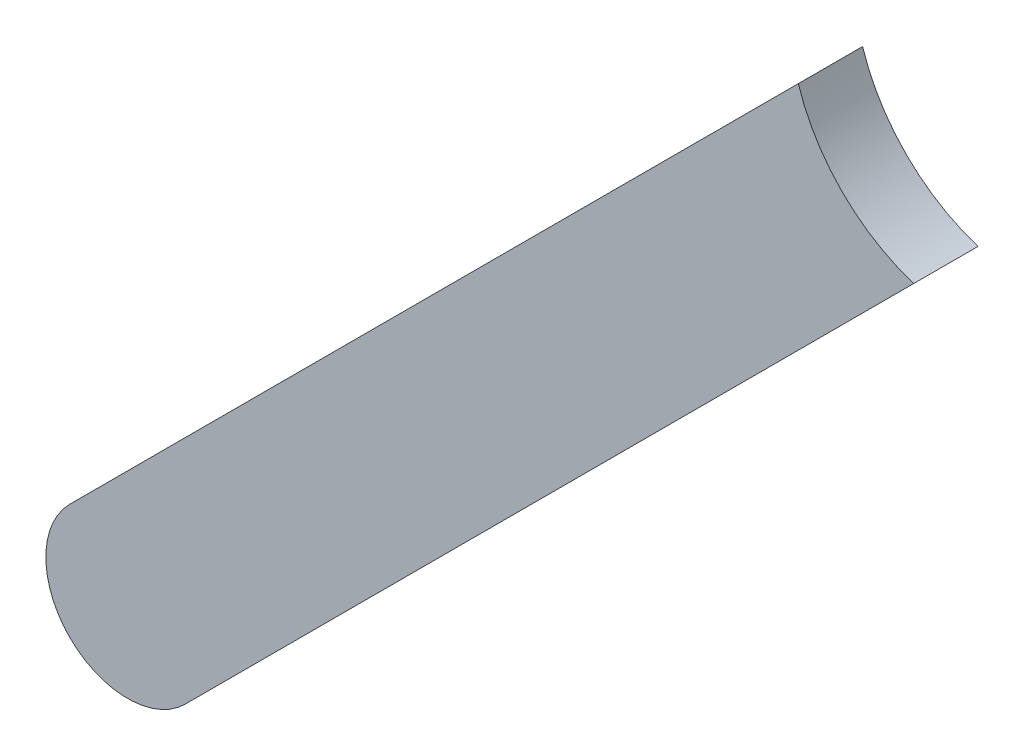
ISO-10303-21;
HEADER;
FILE_DESCRIPTION(('STEP AP214'),'2;1');
FILE_NAME('part.step','',(''),(''),'','','');
FILE_SCHEMA(('AUTOMOTIVE_DESIGN { 1 0 10303 214 1 1 1 1 }'));
ENDSEC;
DATA;
#1=APPLICATION_CONTEXT('core data for automotive mechanical design processes');
#2=APPLICATION_PROTOCOL_DEFINITION('international standard','automotive_design',2000,#1);
#3=PRODUCT_CONTEXT('',#1,'mechanical');
#4=PRODUCT('Part','Part','',(#3));
#5=PRODUCT_RELATED_PRODUCT_CATEGORY('part','',(#4));
#6=PRODUCT_DEFINITION_FORMATION('','',#4);
#7=PRODUCT_DEFINITION_CONTEXT('part definition',#1,'design');
#8=PRODUCT_DEFINITION('design','',#6,#7);
#9=PRODUCT_DEFINITION_SHAPE('','',#8);
#10=(LENGTH_UNIT() NAMED_UNIT(*) SI_UNIT(.MILLI.,.METRE.));
#11=(NAMED_UNIT(*) PLANE_ANGLE_UNIT() SI_UNIT($,.RADIAN.));
#12=(NAMED_UNIT(*) SI_UNIT($,.STERADIAN.) SOLID_ANGLE_UNIT());
#13=UNCERTAINTY_MEASURE_WITH_UNIT(LENGTH_MEASURE(1.E-05),#10,'distance_accuracy_value','');
#14=(GEOMETRIC_REPRESENTATION_CONTEXT(3) GLOBAL_UNCERTAINTY_ASSIGNED_CONTEXT((#13)) GLOBAL_UNIT_ASSIGNED_CONTEXT((#10,
#11,#12)) REPRESENTATION_CONTEXT('',''));
#15=CARTESIAN_POINT('',(0.,0.,0.));
#16=DIRECTION('',(0.,0.,1.));
#17=DIRECTION('',(1.,0.,0.));
#18=AXIS2_PLACEMENT_3D('',#15,#16,#17);
#19=CARTESIAN_POINT('',(106.65640594,93.21319686,0.));
#20=DIRECTION('',(-0.707106781186546,0.70710678118655,0.));
#21=DIRECTION('',(0.70710678118655,0.707106781186546,0.));
#22=AXIS2_PLACEMENT_3D('',#19,#20,#21);
#23=PLANE('',#22);
#24=DIRECTION('',(0.707106781186549,0.707106781186546,0.));
#25=VECTOR('',#24,1.);
#26=CARTESIAN_POINT('',(106.65640594,93.21319686,0.1999996));
#27=LINE('',#26,#25);
#28=CARTESIAN_POINT('',(106.65640594,93.21319686,0.1999996));
#29=VERTEX_POINT('',#28);
#30=CARTESIAN_POINT('',(108.923672858856,95.4804637788559,0.1999996));
#31=VERTEX_POINT('',#30);
#32=EDGE_CURVE('E11',#29,#31,#27,.T.);
#33=ORIENTED_EDGE('',*,*,#32,.F.);
#34=DIRECTION('',(0.,0.,1.));
#35=VECTOR('',#34,1.);
#36=CARTESIAN_POINT('',(106.65640594,93.21319686,0.));
#37=LINE('',#36,#35);
#38=CARTESIAN_POINT('',(106.65640594,93.21319686,0.));
#39=VERTEX_POINT('',#38);
#40=EDGE_CURVE('E24',#39,#29,#37,.T.);
#41=ORIENTED_EDGE('',*,*,#40,.F.);
#42=DIRECTION('',(0.707106781186549,0.707106781186546,0.));
#43=VECTOR('',#42,1.);
#44=CARTESIAN_POINT('',(106.65640594,93.21319686,0.));
#45=LINE('',#44,#43);
#46=CARTESIAN_POINT('',(108.923672858856,95.4804637788559,0.));
#47=VERTEX_POINT('',#46);
#48=EDGE_CURVE('E75',#39,#47,#45,.T.);
#49=ORIENTED_EDGE('',*,*,#48,.T.);
#50=DIRECTION('',(0.,0.,1.));
#51=VECTOR('',#50,1.);
#52=CARTESIAN_POINT('',(108.923672858856,95.4804637788559,0.));
#53=LINE('',#52,#51);
#54=EDGE_CURVE('E37',#47,#31,#53,.T.);
#55=ORIENTED_EDGE('',*,*,#54,.T.);
#56=EDGE_LOOP('',(#33,#41,#49,#55));
#57=FACE_BOUND('',#56,.T.);
#58=ADVANCED_FACE('F17',(#57),#23,.F.);
#59=CARTESIAN_POINT('',(109.093,96.0090028,0.));
#60=DIRECTION('',(0.,0.,-1.));
#61=DIRECTION('',(1.,0.,0.));
#62=AXIS2_PLACEMENT_3D('',#59,#60,#61);
#63=CYLINDRICAL_SURFACE('',#62,0.55500016);
#64=DIRECTION('',(0.,0.,1.));
#65=VECTOR('',#64,1.);
#66=CARTESIAN_POINT('',(108.564460978856,95.8396756588559,0.));
#67=LINE('',#66,#65);
#68=CARTESIAN_POINT('',(108.564460978856,95.8396756588559,0.));
#69=VERTEX_POINT('',#68);
#70=CARTESIAN_POINT('',(108.564460978856,95.8396756588559,0.1999996));
#71=VERTEX_POINT('',#70);
#72=EDGE_CURVE('E67',#69,#71,#67,.T.);
#73=ORIENTED_EDGE('',*,*,#72,.T.);
#74=CARTESIAN_POINT('',(109.093,96.0090028,0.1999996));
#75=DIRECTION('',(0.,0.,1.));
#76=DIRECTION('',(1.,0.,0.));
#77=AXIS2_PLACEMENT_3D('',#74,#75,#76);
#78=CIRCLE('',#77,0.55500016);
#79=EDGE_CURVE('E82',#71,#31,#78,.T.);
#80=ORIENTED_EDGE('',*,*,#79,.T.);
#81=ORIENTED_EDGE('',*,*,#54,.F.);
#82=CARTESIAN_POINT('',(109.093,96.0090028,0.));
#83=DIRECTION('',(0.,0.,1.));
#84=DIRECTION('',(1.,0.,0.));
#85=AXIS2_PLACEMENT_3D('',#82,#83,#84);
#86=CIRCLE('',#85,0.55500016);
#87=EDGE_CURVE('E80',#69,#47,#86,.T.);
#88=ORIENTED_EDGE('',*,*,#87,.F.);
#89=EDGE_LOOP('',(#73,#80,#81,#88));
#90=FACE_BOUND('',#89,.T.);
#91=ADVANCED_FACE('F88',(#90),#63,.F.);
#92=CARTESIAN_POINT('',(108.564460978856,95.8396756588559,0.));
#93=DIRECTION('',(0.707106781186546,-0.70710678118655,0.));
#94=DIRECTION('',(-0.70710678118655,-0.707106781186546,0.));
#95=AXIS2_PLACEMENT_3D('',#92,#93,#94);
#96=PLANE('',#95);
#97=DIRECTION('',(-0.707106781186549,-0.707106781186546,0.));
#98=VECTOR('',#97,1.);
#99=CARTESIAN_POINT('',(108.91339406,96.18860874,0.1999996));
#100=LINE('',#99,#98);
#101=CARTESIAN_POINT('',(106.29719406,93.57240874,0.1999996));
#102=VERTEX_POINT('',#101);
#103=EDGE_CURVE('E71',#71,#102,#100,.T.);
#104=ORIENTED_EDGE('',*,*,#103,.F.);
#105=ORIENTED_EDGE('',*,*,#72,.F.);
#106=DIRECTION('',(-0.707106781186549,-0.707106781186546,0.));
#107=VECTOR('',#106,1.);
#108=CARTESIAN_POINT('',(108.91339406,96.18860874,0.));
#109=LINE('',#108,#107);
#110=CARTESIAN_POINT('',(106.29719406,93.57240874,0.));
#111=VERTEX_POINT('',#110);
#112=EDGE_CURVE('E63',#69,#111,#109,.T.);
#113=ORIENTED_EDGE('',*,*,#112,.T.);
#114=DIRECTION('',(0.,0.,1.));
#115=VECTOR('',#114,1.);
#116=CARTESIAN_POINT('',(106.29719406,93.57240874,0.));
#117=LINE('',#116,#115);
#118=EDGE_CURVE('E53',#111,#102,#117,.T.);
#119=ORIENTED_EDGE('',*,*,#118,.T.);
#120=EDGE_LOOP('',(#104,#105,#113,#119));
#121=FACE_BOUND('',#120,.T.);
#122=ADVANCED_FACE('F66',(#121),#96,.F.);
#123=CARTESIAN_POINT('',(106.4768,93.3928028,0.));
#124=DIRECTION('',(0.,0.,-1.));
#125=DIRECTION('',(-0.707106781186548,0.707106781186548,0.));
#126=AXIS2_PLACEMENT_3D('',#123,#124,#125);
#127=CYLINDRICAL_SURFACE('',#126,0.254001156230771);
#128=CARTESIAN_POINT('',(106.4768,93.3928028,0.1999996));
#129=DIRECTION('',(0.,0.,1.));
#130=DIRECTION('',(-0.707106781186548,0.707106781186548,0.));
#131=AXIS2_PLACEMENT_3D('',#128,#129,#130);
#132=CIRCLE('',#131,0.254001156230771);
#133=EDGE_CURVE('E59',#102,#29,#132,.T.);
#134=ORIENTED_EDGE('',*,*,#133,.F.);
#135=ORIENTED_EDGE('',*,*,#118,.F.);
#136=CARTESIAN_POINT('',(106.4768,93.3928028,0.));
#137=DIRECTION('',(0.,0.,1.));
#138=DIRECTION('',(-0.707106781186548,0.707106781186548,0.));
#139=AXIS2_PLACEMENT_3D('',#136,#137,#138);
#140=CIRCLE('',#139,0.254001156230771);
#141=EDGE_CURVE('E57',#111,#39,#140,.T.);
#142=ORIENTED_EDGE('',*,*,#141,.T.);
#143=ORIENTED_EDGE('',*,*,#40,.T.);
#144=EDGE_LOOP('',(#134,#135,#142,#143));
#145=FACE_BOUND('',#144,.T.);
#146=ADVANCED_FACE('F55',(#145),#127,.T.);
#147=CARTESIAN_POINT('',(106.65640594,93.21319686,0.));
#148=DIRECTION('',(0.,0.,-1.));
#149=DIRECTION('',(-1.,0.,0.));
#150=AXIS2_PLACEMENT_3D('',#147,#148,#149);
#151=PLANE('',#150);
#152=ORIENTED_EDGE('',*,*,#48,.F.);
#153=ORIENTED_EDGE('',*,*,#141,.F.);
#154=ORIENTED_EDGE('',*,*,#112,.F.);
#155=ORIENTED_EDGE('',*,*,#87,.T.);
#156=EDGE_LOOP('',(#152,#153,#154,#155));
#157=FACE_BOUND('',#156,.T.);
#158=ADVANCED_FACE('F74',(#157),#151,.T.);
#159=CARTESIAN_POINT('',(106.65640594,93.21319686,0.1999996));
#160=DIRECTION('',(0.,0.,-1.));
#161=DIRECTION('',(-1.,0.,0.));
#162=AXIS2_PLACEMENT_3D('',#159,#160,#161);
#163=PLANE('',#162);
#164=ORIENTED_EDGE('',*,*,#133,.T.);
#165=ORIENTED_EDGE('',*,*,#32,.T.);
#166=ORIENTED_EDGE('',*,*,#79,.F.);
#167=ORIENTED_EDGE('',*,*,#103,.T.);
#168=EDGE_LOOP('',(#164,#165,#166,#167));
#169=FACE_BOUND('',#168,.T.);
#170=ADVANCED_FACE('F91',(#169),#163,.F.);
#171=CLOSED_SHELL('',(#58,#91,#122,#146,#158,#170));
#172=MANIFOLD_SOLID_BREP('B1',#171);
#173=ADVANCED_BREP_SHAPE_REPRESENTATION('',(#18,#172),#14);
#174=SHAPE_DEFINITION_REPRESENTATION(#9,#173);
ENDSEC;
END-ISO-10303-21;
